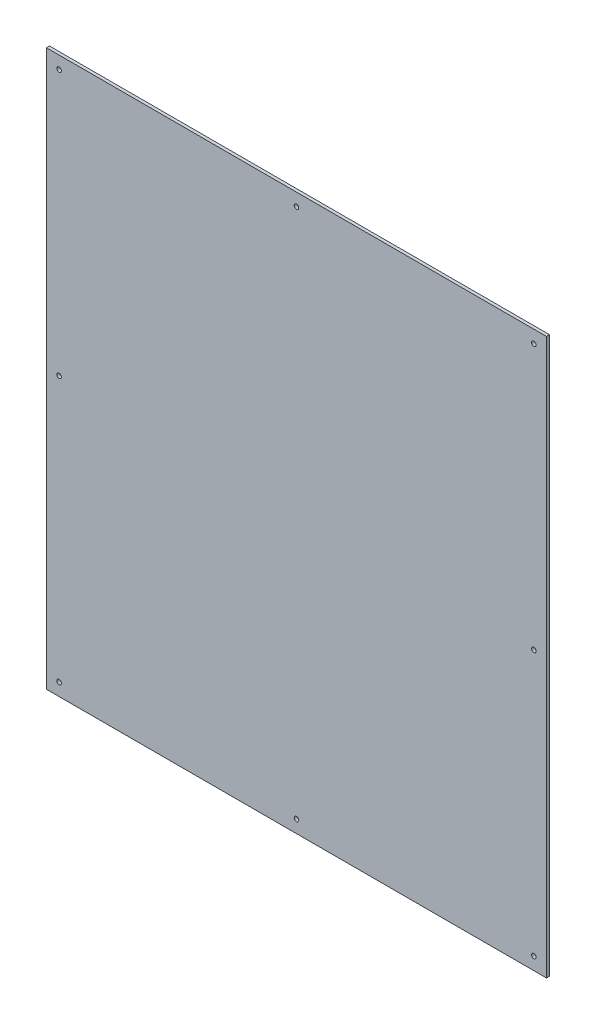
ISO-10303-21;
HEADER;
FILE_DESCRIPTION(('STEP AP214'),'2;1');
FILE_NAME('part.step','',(''),(''),'','','');
FILE_SCHEMA(('AUTOMOTIVE_DESIGN { 1 0 10303 214 1 1 1 1 }'));
ENDSEC;
DATA;
#1=APPLICATION_CONTEXT('core data for automotive mechanical design processes');
#2=APPLICATION_PROTOCOL_DEFINITION('international standard','automotive_design',2000,#1);
#3=PRODUCT_CONTEXT('',#1,'mechanical');
#4=PRODUCT('Part','Part','',(#3));
#5=PRODUCT_RELATED_PRODUCT_CATEGORY('part','',(#4));
#6=PRODUCT_DEFINITION_FORMATION('','',#4);
#7=PRODUCT_DEFINITION_CONTEXT('part definition',#1,'design');
#8=PRODUCT_DEFINITION('design','',#6,#7);
#9=PRODUCT_DEFINITION_SHAPE('','',#8);
#10=(LENGTH_UNIT() NAMED_UNIT(*) SI_UNIT(.MILLI.,.METRE.));
#11=(NAMED_UNIT(*) PLANE_ANGLE_UNIT() SI_UNIT($,.RADIAN.));
#12=(NAMED_UNIT(*) SI_UNIT($,.STERADIAN.) SOLID_ANGLE_UNIT());
#13=UNCERTAINTY_MEASURE_WITH_UNIT(LENGTH_MEASURE(1.E-05),#10,'distance_accuracy_value','');
#14=(GEOMETRIC_REPRESENTATION_CONTEXT(3) GLOBAL_UNCERTAINTY_ASSIGNED_CONTEXT((#13)) GLOBAL_UNIT_ASSIGNED_CONTEXT((#10,
#11,#12)) REPRESENTATION_CONTEXT('',''));
#15=CARTESIAN_POINT('',(0.,0.,0.));
#16=DIRECTION('',(0.,0.,1.));
#17=DIRECTION('',(1.,0.,0.));
#18=AXIS2_PLACEMENT_3D('',#15,#16,#17);
#19=CARTESIAN_POINT('',(0.,0.,0.));
#20=DIRECTION('',(0.,0.,-1.));
#21=DIRECTION('',(-1.,0.,0.));
#22=AXIS2_PLACEMENT_3D('',#19,#20,#21);
#23=PLANE('',#22);
#24=CARTESIAN_POINT('',(12.5,275.000000000009,0.));
#25=DIRECTION('',(0.,0.,1.));
#26=DIRECTION('',(1.,0.,0.));
#27=AXIS2_PLACEMENT_3D('',#24,#25,#26);
#28=CIRCLE('',#27,2.25);
#29=CARTESIAN_POINT('',(14.75,275.000000000009,0.));
#30=VERTEX_POINT('',#29);
#31=EDGE_CURVE('E152',#30,#30,#28,.T.);
#32=ORIENTED_EDGE('',*,*,#31,.T.);
#33=EDGE_LOOP('',(#32));
#34=FACE_BOUND('',#33,.T.);
#35=DIRECTION('',(0.,-1.,0.));
#36=VECTOR('',#35,1.);
#37=CARTESIAN_POINT('',(0.,0.,0.));
#38=LINE('',#37,#36);
#39=CARTESIAN_POINT('',(0.,550.000000000019,0.));
#40=VERTEX_POINT('',#39);
#41=CARTESIAN_POINT('',(0.,0.,0.));
#42=VERTEX_POINT('',#41);
#43=EDGE_CURVE('E97',#40,#42,#38,.T.);
#44=ORIENTED_EDGE('',*,*,#43,.F.);
#45=DIRECTION('',(-1.,0.,0.));
#46=VECTOR('',#45,1.);
#47=CARTESIAN_POINT('',(0.,550.000000000019,0.));
#48=LINE('',#47,#46);
#49=CARTESIAN_POINT('',(495.000000000037,550.000000000019,0.));
#50=VERTEX_POINT('',#49);
#51=EDGE_CURVE('E73',#50,#40,#48,.T.);
#52=ORIENTED_EDGE('',*,*,#51,.F.);
#53=DIRECTION('',(0.,1.,0.));
#54=VECTOR('',#53,1.);
#55=CARTESIAN_POINT('',(495.000000000037,0.,0.));
#56=LINE('',#55,#54);
#57=CARTESIAN_POINT('',(495.000000000037,0.,0.));
#58=VERTEX_POINT('',#57);
#59=EDGE_CURVE('E67',#58,#50,#56,.T.);
#60=ORIENTED_EDGE('',*,*,#59,.F.);
#61=DIRECTION('',(1.,0.,0.));
#62=VECTOR('',#61,1.);
#63=CARTESIAN_POINT('',(0.,0.,0.));
#64=LINE('',#63,#62);
#65=EDGE_CURVE('E89',#42,#58,#64,.T.);
#66=ORIENTED_EDGE('',*,*,#65,.F.);
#67=EDGE_LOOP('',(#44,#52,#60,#66));
#68=FACE_BOUND('',#67,.T.);
#69=CARTESIAN_POINT('',(247.500000000018,537.500000000019,0.));
#70=DIRECTION('',(0.,0.,1.));
#71=DIRECTION('',(1.,0.,0.));
#72=AXIS2_PLACEMENT_3D('',#69,#70,#71);
#73=CIRCLE('',#72,2.25);
#74=CARTESIAN_POINT('',(249.750000000018,537.500000000019,0.));
#75=VERTEX_POINT('',#74);
#76=EDGE_CURVE('E100',#75,#75,#73,.T.);
#77=ORIENTED_EDGE('',*,*,#76,.T.);
#78=EDGE_LOOP('',(#77));
#79=FACE_BOUND('',#78,.T.);
#80=CARTESIAN_POINT('',(482.500000000037,537.500000000019,0.));
#81=DIRECTION('',(0.,0.,1.));
#82=DIRECTION('',(1.,0.,0.));
#83=AXIS2_PLACEMENT_3D('',#80,#81,#82);
#84=CIRCLE('',#83,2.24999999999997);
#85=CARTESIAN_POINT('',(484.750000000037,537.500000000019,0.));
#86=VERTEX_POINT('',#85);
#87=EDGE_CURVE('E116',#86,#86,#84,.T.);
#88=ORIENTED_EDGE('',*,*,#87,.T.);
#89=EDGE_LOOP('',(#88));
#90=FACE_BOUND('',#89,.T.);
#91=CARTESIAN_POINT('',(482.500000000037,275.000000000009,0.));
#92=DIRECTION('',(0.,0.,1.));
#93=DIRECTION('',(1.,0.,0.));
#94=AXIS2_PLACEMENT_3D('',#91,#92,#93);
#95=CIRCLE('',#94,2.24999999999997);
#96=CARTESIAN_POINT('',(484.750000000037,275.000000000009,0.));
#97=VERTEX_POINT('',#96);
#98=EDGE_CURVE('E122',#97,#97,#95,.T.);
#99=ORIENTED_EDGE('',*,*,#98,.T.);
#100=EDGE_LOOP('',(#99));
#101=FACE_BOUND('',#100,.T.);
#102=CARTESIAN_POINT('',(482.500000000037,12.5,0.));
#103=DIRECTION('',(0.,0.,1.));
#104=DIRECTION('',(1.,0.,0.));
#105=AXIS2_PLACEMENT_3D('',#102,#103,#104);
#106=CIRCLE('',#105,2.24999999999997);
#107=CARTESIAN_POINT('',(484.750000000037,12.5,0.));
#108=VERTEX_POINT('',#107);
#109=EDGE_CURVE('E128',#108,#108,#106,.T.);
#110=ORIENTED_EDGE('',*,*,#109,.T.);
#111=EDGE_LOOP('',(#110));
#112=FACE_BOUND('',#111,.T.);
#113=CARTESIAN_POINT('',(247.500000000018,12.5,0.));
#114=DIRECTION('',(0.,0.,1.));
#115=DIRECTION('',(1.,0.,0.));
#116=AXIS2_PLACEMENT_3D('',#113,#114,#115);
#117=CIRCLE('',#116,2.25);
#118=CARTESIAN_POINT('',(249.750000000018,12.5,0.));
#119=VERTEX_POINT('',#118);
#120=EDGE_CURVE('E134',#119,#119,#117,.T.);
#121=ORIENTED_EDGE('',*,*,#120,.T.);
#122=EDGE_LOOP('',(#121));
#123=FACE_BOUND('',#122,.T.);
#124=CARTESIAN_POINT('',(12.5,12.5,0.));
#125=DIRECTION('',(0.,0.,1.));
#126=DIRECTION('',(1.,0.,0.));
#127=AXIS2_PLACEMENT_3D('',#124,#125,#126);
#128=CIRCLE('',#127,2.25);
#129=CARTESIAN_POINT('',(14.75,12.5,0.));
#130=VERTEX_POINT('',#129);
#131=EDGE_CURVE('E140',#130,#130,#128,.T.);
#132=ORIENTED_EDGE('',*,*,#131,.T.);
#133=EDGE_LOOP('',(#132));
#134=FACE_BOUND('',#133,.T.);
#135=CARTESIAN_POINT('',(12.5,537.500000000019,0.));
#136=DIRECTION('',(0.,0.,1.));
#137=DIRECTION('',(1.,0.,0.));
#138=AXIS2_PLACEMENT_3D('',#135,#136,#137);
#139=CIRCLE('',#138,2.25);
#140=CARTESIAN_POINT('',(14.75,537.500000000019,0.));
#141=VERTEX_POINT('',#140);
#142=EDGE_CURVE('E146',#141,#141,#139,.T.);
#143=ORIENTED_EDGE('',*,*,#142,.T.);
#144=EDGE_LOOP('',(#143));
#145=FACE_BOUND('',#144,.T.);
#146=ADVANCED_FACE('F33',(#34,#68,#79,#90,#101,#112,#123,#134,#145),#23,.T.);
#147=CARTESIAN_POINT('',(0.,0.,3.));
#148=DIRECTION('',(1.,0.,0.));
#149=DIRECTION('',(0.,0.,-1.));
#150=AXIS2_PLACEMENT_3D('',#147,#148,#149);
#151=PLANE('',#150);
#152=ORIENTED_EDGE('',*,*,#43,.T.);
#153=DIRECTION('',(0.,0.,-1.));
#154=VECTOR('',#153,1.);
#155=CARTESIAN_POINT('',(0.,0.,3.));
#156=LINE('',#155,#154);
#157=CARTESIAN_POINT('',(0.,0.,3.));
#158=VERTEX_POINT('',#157);
#159=EDGE_CURVE('E11',#158,#42,#156,.T.);
#160=ORIENTED_EDGE('',*,*,#159,.F.);
#161=DIRECTION('',(0.,-1.,0.));
#162=VECTOR('',#161,1.);
#163=CARTESIAN_POINT('',(0.,0.,3.));
#164=LINE('',#163,#162);
#165=CARTESIAN_POINT('',(0.,550.000000000019,3.));
#166=VERTEX_POINT('',#165);
#167=EDGE_CURVE('E85',#166,#158,#164,.T.);
#168=ORIENTED_EDGE('',*,*,#167,.F.);
#169=DIRECTION('',(0.,0.,-1.));
#170=VECTOR('',#169,1.);
#171=CARTESIAN_POINT('',(0.,550.000000000019,3.));
#172=LINE('',#171,#170);
#173=EDGE_CURVE('E93',#166,#40,#172,.T.);
#174=ORIENTED_EDGE('',*,*,#173,.T.);
#175=EDGE_LOOP('',(#152,#160,#168,#174));
#176=FACE_BOUND('',#175,.T.);
#177=ADVANCED_FACE('F35',(#176),#151,.F.);
#178=CARTESIAN_POINT('',(0.,0.,3.));
#179=DIRECTION('',(0.,1.,0.));
#180=DIRECTION('',(0.,0.,1.));
#181=AXIS2_PLACEMENT_3D('',#178,#179,#180);
#182=PLANE('',#181);
#183=ORIENTED_EDGE('',*,*,#65,.T.);
#184=DIRECTION('',(0.,0.,-1.));
#185=VECTOR('',#184,1.);
#186=CARTESIAN_POINT('',(495.000000000037,0.,3.));
#187=LINE('',#186,#185);
#188=CARTESIAN_POINT('',(495.000000000037,0.,3.));
#189=VERTEX_POINT('',#188);
#190=EDGE_CURVE('E42',#189,#58,#187,.T.);
#191=ORIENTED_EDGE('',*,*,#190,.F.);
#192=DIRECTION('',(1.,0.,0.));
#193=VECTOR('',#192,1.);
#194=CARTESIAN_POINT('',(0.,0.,3.));
#195=LINE('',#194,#193);
#196=EDGE_CURVE('E80',#158,#189,#195,.T.);
#197=ORIENTED_EDGE('',*,*,#196,.F.);
#198=ORIENTED_EDGE('',*,*,#159,.T.);
#199=EDGE_LOOP('',(#183,#191,#197,#198));
#200=FACE_BOUND('',#199,.T.);
#201=ADVANCED_FACE('F88',(#200),#182,.F.);
#202=CARTESIAN_POINT('',(495.000000000037,0.,3.));
#203=DIRECTION('',(-1.,0.,0.));
#204=DIRECTION('',(0.,0.,1.));
#205=AXIS2_PLACEMENT_3D('',#202,#203,#204);
#206=PLANE('',#205);
#207=ORIENTED_EDGE('',*,*,#59,.T.);
#208=DIRECTION('',(0.,0.,-1.));
#209=VECTOR('',#208,1.);
#210=CARTESIAN_POINT('',(495.000000000037,550.000000000019,3.));
#211=LINE('',#210,#209);
#212=CARTESIAN_POINT('',(495.000000000037,550.000000000019,3.));
#213=VERTEX_POINT('',#212);
#214=EDGE_CURVE('E90',#213,#50,#211,.T.);
#215=ORIENTED_EDGE('',*,*,#214,.F.);
#216=DIRECTION('',(0.,1.,0.));
#217=VECTOR('',#216,1.);
#218=CARTESIAN_POINT('',(495.000000000037,0.,3.));
#219=LINE('',#218,#217);
#220=EDGE_CURVE('E83',#189,#213,#219,.T.);
#221=ORIENTED_EDGE('',*,*,#220,.F.);
#222=ORIENTED_EDGE('',*,*,#190,.T.);
#223=EDGE_LOOP('',(#207,#215,#221,#222));
#224=FACE_BOUND('',#223,.T.);
#225=ADVANCED_FACE('F91',(#224),#206,.F.);
#226=CARTESIAN_POINT('',(0.,550.000000000019,3.));
#227=DIRECTION('',(0.,-1.,0.));
#228=DIRECTION('',(0.,0.,-1.));
#229=AXIS2_PLACEMENT_3D('',#226,#227,#228);
#230=PLANE('',#229);
#231=ORIENTED_EDGE('',*,*,#51,.T.);
#232=ORIENTED_EDGE('',*,*,#173,.F.);
#233=DIRECTION('',(-1.,0.,0.));
#234=VECTOR('',#233,1.);
#235=CARTESIAN_POINT('',(0.,550.000000000019,3.));
#236=LINE('',#235,#234);
#237=EDGE_CURVE('E50',#213,#166,#236,.T.);
#238=ORIENTED_EDGE('',*,*,#237,.F.);
#239=ORIENTED_EDGE('',*,*,#214,.T.);
#240=EDGE_LOOP('',(#231,#232,#238,#239));
#241=FACE_BOUND('',#240,.T.);
#242=ADVANCED_FACE('F105',(#241),#230,.F.);
#243=CARTESIAN_POINT('',(0.,0.,3.));
#244=DIRECTION('',(0.,0.,-1.));
#245=DIRECTION('',(-1.,0.,0.));
#246=AXIS2_PLACEMENT_3D('',#243,#244,#245);
#247=PLANE('',#246);
#248=CARTESIAN_POINT('',(12.5,275.000000000009,3.));
#249=DIRECTION('',(0.,0.,1.));
#250=DIRECTION('',(1.,0.,0.));
#251=AXIS2_PLACEMENT_3D('',#248,#249,#250);
#252=CIRCLE('',#251,2.25);
#253=CARTESIAN_POINT('',(14.75,275.000000000009,3.));
#254=VERTEX_POINT('',#253);
#255=EDGE_CURVE('E155',#254,#254,#252,.T.);
#256=ORIENTED_EDGE('',*,*,#255,.F.);
#257=EDGE_LOOP('',(#256));
#258=FACE_BOUND('',#257,.T.);
#259=CARTESIAN_POINT('',(12.5,537.500000000019,3.));
#260=DIRECTION('',(0.,0.,1.));
#261=DIRECTION('',(1.,0.,0.));
#262=AXIS2_PLACEMENT_3D('',#259,#260,#261);
#263=CIRCLE('',#262,2.25);
#264=CARTESIAN_POINT('',(14.75,537.500000000019,3.));
#265=VERTEX_POINT('',#264);
#266=EDGE_CURVE('E149',#265,#265,#263,.T.);
#267=ORIENTED_EDGE('',*,*,#266,.F.);
#268=EDGE_LOOP('',(#267));
#269=FACE_BOUND('',#268,.T.);
#270=CARTESIAN_POINT('',(12.5,12.5,3.));
#271=DIRECTION('',(0.,0.,1.));
#272=DIRECTION('',(1.,0.,0.));
#273=AXIS2_PLACEMENT_3D('',#270,#271,#272);
#274=CIRCLE('',#273,2.25);
#275=CARTESIAN_POINT('',(14.75,12.5,3.));
#276=VERTEX_POINT('',#275);
#277=EDGE_CURVE('E143',#276,#276,#274,.T.);
#278=ORIENTED_EDGE('',*,*,#277,.F.);
#279=EDGE_LOOP('',(#278));
#280=FACE_BOUND('',#279,.T.);
#281=CARTESIAN_POINT('',(247.500000000018,12.5,3.));
#282=DIRECTION('',(0.,0.,1.));
#283=DIRECTION('',(1.,0.,0.));
#284=AXIS2_PLACEMENT_3D('',#281,#282,#283);
#285=CIRCLE('',#284,2.25);
#286=CARTESIAN_POINT('',(249.750000000018,12.5,3.));
#287=VERTEX_POINT('',#286);
#288=EDGE_CURVE('E137',#287,#287,#285,.T.);
#289=ORIENTED_EDGE('',*,*,#288,.F.);
#290=EDGE_LOOP('',(#289));
#291=FACE_BOUND('',#290,.T.);
#292=CARTESIAN_POINT('',(482.500000000037,12.5,3.));
#293=DIRECTION('',(0.,0.,1.));
#294=DIRECTION('',(1.,0.,0.));
#295=AXIS2_PLACEMENT_3D('',#292,#293,#294);
#296=CIRCLE('',#295,2.24999999999997);
#297=CARTESIAN_POINT('',(484.750000000037,12.5,3.));
#298=VERTEX_POINT('',#297);
#299=EDGE_CURVE('E131',#298,#298,#296,.T.);
#300=ORIENTED_EDGE('',*,*,#299,.F.);
#301=EDGE_LOOP('',(#300));
#302=FACE_BOUND('',#301,.T.);
#303=CARTESIAN_POINT('',(482.500000000037,275.000000000009,3.));
#304=DIRECTION('',(0.,0.,1.));
#305=DIRECTION('',(1.,0.,0.));
#306=AXIS2_PLACEMENT_3D('',#303,#304,#305);
#307=CIRCLE('',#306,2.24999999999997);
#308=CARTESIAN_POINT('',(484.750000000037,275.000000000009,3.));
#309=VERTEX_POINT('',#308);
#310=EDGE_CURVE('E125',#309,#309,#307,.T.);
#311=ORIENTED_EDGE('',*,*,#310,.F.);
#312=EDGE_LOOP('',(#311));
#313=FACE_BOUND('',#312,.T.);
#314=CARTESIAN_POINT('',(482.500000000037,537.500000000019,3.));
#315=DIRECTION('',(0.,0.,1.));
#316=DIRECTION('',(1.,0.,0.));
#317=AXIS2_PLACEMENT_3D('',#314,#315,#316);
#318=CIRCLE('',#317,2.24999999999997);
#319=CARTESIAN_POINT('',(484.750000000037,537.500000000019,3.));
#320=VERTEX_POINT('',#319);
#321=EDGE_CURVE('E119',#320,#320,#318,.T.);
#322=ORIENTED_EDGE('',*,*,#321,.F.);
#323=EDGE_LOOP('',(#322));
#324=FACE_BOUND('',#323,.T.);
#325=CARTESIAN_POINT('',(247.500000000018,537.500000000019,3.));
#326=DIRECTION('',(0.,0.,1.));
#327=DIRECTION('',(1.,0.,0.));
#328=AXIS2_PLACEMENT_3D('',#325,#326,#327);
#329=CIRCLE('',#328,2.25);
#330=CARTESIAN_POINT('',(249.750000000018,537.500000000019,3.));
#331=VERTEX_POINT('',#330);
#332=EDGE_CURVE('E113',#331,#331,#329,.T.);
#333=ORIENTED_EDGE('',*,*,#332,.F.);
#334=EDGE_LOOP('',(#333));
#335=FACE_BOUND('',#334,.T.);
#336=ORIENTED_EDGE('',*,*,#167,.T.);
#337=ORIENTED_EDGE('',*,*,#196,.T.);
#338=ORIENTED_EDGE('',*,*,#220,.T.);
#339=ORIENTED_EDGE('',*,*,#237,.T.);
#340=EDGE_LOOP('',(#336,#337,#338,#339));
#341=FACE_BOUND('',#340,.T.);
#342=ADVANCED_FACE('F81',(#258,#269,#280,#291,#302,#313,#324,#335,#341),#247,.F.);
#343=CARTESIAN_POINT('',(247.500000000018,537.500000000019,3.));
#344=DIRECTION('',(0.,0.,1.));
#345=DIRECTION('',(1.,0.,0.));
#346=AXIS2_PLACEMENT_3D('',#343,#344,#345);
#347=CYLINDRICAL_SURFACE('',#346,2.25);
#348=ORIENTED_EDGE('',*,*,#76,.F.);
#349=EDGE_LOOP('',(#348));
#350=FACE_BOUND('',#349,.T.);
#351=ORIENTED_EDGE('',*,*,#332,.T.);
#352=EDGE_LOOP('',(#351));
#353=FACE_BOUND('',#352,.T.);
#354=ADVANCED_FACE('F163',(#350,#353),#347,.F.);
#355=CARTESIAN_POINT('',(482.500000000037,537.500000000019,3.));
#356=DIRECTION('',(0.,0.,1.));
#357=DIRECTION('',(1.,0.,0.));
#358=AXIS2_PLACEMENT_3D('',#355,#356,#357);
#359=CYLINDRICAL_SURFACE('',#358,2.24999999999997);
#360=ORIENTED_EDGE('',*,*,#87,.F.);
#361=EDGE_LOOP('',(#360));
#362=FACE_BOUND('',#361,.T.);
#363=ORIENTED_EDGE('',*,*,#321,.T.);
#364=EDGE_LOOP('',(#363));
#365=FACE_BOUND('',#364,.T.);
#366=ADVANCED_FACE('F180',(#362,#365),#359,.F.);
#367=CARTESIAN_POINT('',(482.500000000037,275.000000000009,3.));
#368=DIRECTION('',(0.,0.,1.));
#369=DIRECTION('',(1.,0.,0.));
#370=AXIS2_PLACEMENT_3D('',#367,#368,#369);
#371=CYLINDRICAL_SURFACE('',#370,2.24999999999997);
#372=ORIENTED_EDGE('',*,*,#98,.F.);
#373=EDGE_LOOP('',(#372));
#374=FACE_BOUND('',#373,.T.);
#375=ORIENTED_EDGE('',*,*,#310,.T.);
#376=EDGE_LOOP('',(#375));
#377=FACE_BOUND('',#376,.T.);
#378=ADVANCED_FACE('F186',(#374,#377),#371,.F.);
#379=CARTESIAN_POINT('',(482.500000000037,12.5,3.));
#380=DIRECTION('',(0.,0.,1.));
#381=DIRECTION('',(1.,0.,0.));
#382=AXIS2_PLACEMENT_3D('',#379,#380,#381);
#383=CYLINDRICAL_SURFACE('',#382,2.24999999999997);
#384=ORIENTED_EDGE('',*,*,#109,.F.);
#385=EDGE_LOOP('',(#384));
#386=FACE_BOUND('',#385,.T.);
#387=ORIENTED_EDGE('',*,*,#299,.T.);
#388=EDGE_LOOP('',(#387));
#389=FACE_BOUND('',#388,.T.);
#390=ADVANCED_FACE('F238',(#386,#389),#383,.F.);
#391=CARTESIAN_POINT('',(247.500000000018,12.5,3.));
#392=DIRECTION('',(0.,0.,1.));
#393=DIRECTION('',(1.,0.,0.));
#394=AXIS2_PLACEMENT_3D('',#391,#392,#393);
#395=CYLINDRICAL_SURFACE('',#394,2.25);
#396=ORIENTED_EDGE('',*,*,#120,.F.);
#397=EDGE_LOOP('',(#396));
#398=FACE_BOUND('',#397,.T.);
#399=ORIENTED_EDGE('',*,*,#288,.T.);
#400=EDGE_LOOP('',(#399));
#401=FACE_BOUND('',#400,.T.);
#402=ADVANCED_FACE('F248',(#398,#401),#395,.F.);
#403=CARTESIAN_POINT('',(12.5,12.5,3.));
#404=DIRECTION('',(0.,0.,1.));
#405=DIRECTION('',(1.,0.,0.));
#406=AXIS2_PLACEMENT_3D('',#403,#404,#405);
#407=CYLINDRICAL_SURFACE('',#406,2.25);
#408=ORIENTED_EDGE('',*,*,#131,.F.);
#409=EDGE_LOOP('',(#408));
#410=FACE_BOUND('',#409,.T.);
#411=ORIENTED_EDGE('',*,*,#277,.T.);
#412=EDGE_LOOP('',(#411));
#413=FACE_BOUND('',#412,.T.);
#414=ADVANCED_FACE('F258',(#410,#413),#407,.F.);
#415=CARTESIAN_POINT('',(12.5,537.500000000019,3.));
#416=DIRECTION('',(0.,0.,1.));
#417=DIRECTION('',(1.,0.,0.));
#418=AXIS2_PLACEMENT_3D('',#415,#416,#417);
#419=CYLINDRICAL_SURFACE('',#418,2.25);
#420=ORIENTED_EDGE('',*,*,#142,.F.);
#421=EDGE_LOOP('',(#420));
#422=FACE_BOUND('',#421,.T.);
#423=ORIENTED_EDGE('',*,*,#266,.T.);
#424=EDGE_LOOP('',(#423));
#425=FACE_BOUND('',#424,.T.);
#426=ADVANCED_FACE('F268',(#422,#425),#419,.F.);
#427=CARTESIAN_POINT('',(12.5,275.000000000009,3.));
#428=DIRECTION('',(0.,0.,1.));
#429=DIRECTION('',(1.,0.,0.));
#430=AXIS2_PLACEMENT_3D('',#427,#428,#429);
#431=CYLINDRICAL_SURFACE('',#430,2.25);
#432=ORIENTED_EDGE('',*,*,#31,.F.);
#433=EDGE_LOOP('',(#432));
#434=FACE_BOUND('',#433,.T.);
#435=ORIENTED_EDGE('',*,*,#255,.T.);
#436=EDGE_LOOP('',(#435));
#437=FACE_BOUND('',#436,.T.);
#438=ADVANCED_FACE('F159',(#434,#437),#431,.F.);
#439=CLOSED_SHELL('',(#146,#177,#201,#225,#242,#342,#354,#366,#378,#390,#402,#414,#426,#438));
#440=MANIFOLD_SOLID_BREP('B2',#439);
#441=ADVANCED_BREP_SHAPE_REPRESENTATION('',(#18,#440),#14);
#442=SHAPE_DEFINITION_REPRESENTATION(#9,#441);
ENDSEC;
END-ISO-10303-21;
